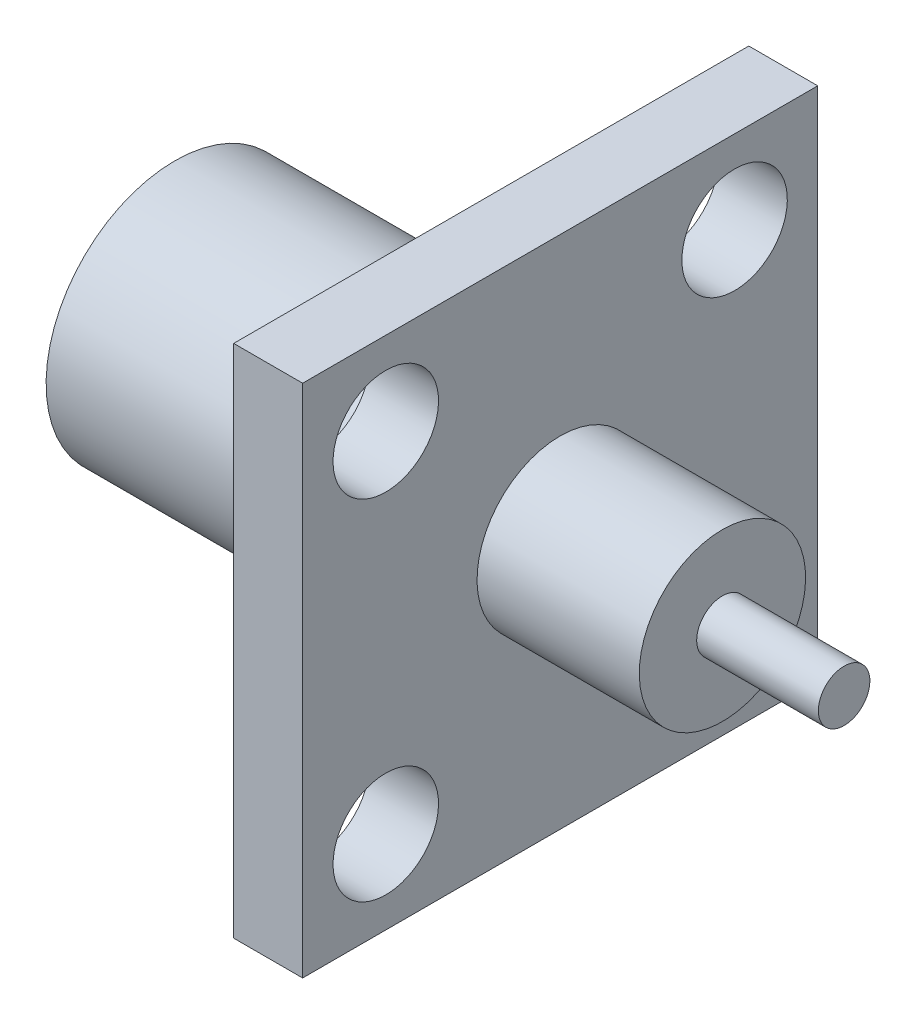
ISO-10303-21;
HEADER;
FILE_DESCRIPTION(('STEP AP214'),'2;1');
FILE_NAME('part.step','',(''),(''),'','','');
FILE_SCHEMA(('AUTOMOTIVE_DESIGN { 1 0 10303 214 1 1 1 1 }'));
ENDSEC;
DATA;
#1=APPLICATION_CONTEXT('core data for automotive mechanical design processes');
#2=APPLICATION_PROTOCOL_DEFINITION('international standard','automotive_design',2000,#1);
#3=PRODUCT_CONTEXT('',#1,'mechanical');
#4=PRODUCT('Part','Part','',(#3));
#5=PRODUCT_RELATED_PRODUCT_CATEGORY('part','',(#4));
#6=PRODUCT_DEFINITION_FORMATION('','',#4);
#7=PRODUCT_DEFINITION_CONTEXT('part definition',#1,'design');
#8=PRODUCT_DEFINITION('design','',#6,#7);
#9=PRODUCT_DEFINITION_SHAPE('','',#8);
#10=(LENGTH_UNIT() NAMED_UNIT(*) SI_UNIT(.MILLI.,.METRE.));
#11=(NAMED_UNIT(*) PLANE_ANGLE_UNIT() SI_UNIT($,.RADIAN.));
#12=(NAMED_UNIT(*) SI_UNIT($,.STERADIAN.) SOLID_ANGLE_UNIT());
#13=UNCERTAINTY_MEASURE_WITH_UNIT(LENGTH_MEASURE(1.E-05),#10,'distance_accuracy_value','');
#14=(GEOMETRIC_REPRESENTATION_CONTEXT(3) GLOBAL_UNCERTAINTY_ASSIGNED_CONTEXT((#13)) GLOBAL_UNIT_ASSIGNED_CONTEXT((#10,
#11,#12)) REPRESENTATION_CONTEXT('',''));
#15=CARTESIAN_POINT('',(0.,0.,0.));
#16=DIRECTION('',(0.,0.,1.));
#17=DIRECTION('',(1.,0.,0.));
#18=AXIS2_PLACEMENT_3D('',#15,#16,#17);
#19=CARTESIAN_POINT('',(2.7,10.725,3.89949632730069));
#20=DIRECTION('',(-1.,0.,0.));
#21=DIRECTION('',(0.,-1.,0.));
#22=AXIS2_PLACEMENT_3D('',#19,#20,#21);
#23=CYLINDRICAL_SURFACE('',#22,0.635);
#24=CARTESIAN_POINT('',(2.7,10.725,3.89949632730069));
#25=DIRECTION('',(1.,0.,0.));
#26=DIRECTION('',(0.,1.,0.));
#27=AXIS2_PLACEMENT_3D('',#24,#25,#26);
#28=CIRCLE('',#27,0.635);
#29=CARTESIAN_POINT('',(2.7,11.36,3.89949632730069));
#30=VERTEX_POINT('',#29);
#31=EDGE_CURVE('P0_E10',#30,#30,#28,.T.);
#32=ORIENTED_EDGE('',*,*,#31,.F.);
#33=EDGE_LOOP('',(#32));
#34=FACE_BOUND('',#33,.T.);
#35=CARTESIAN_POINT('',(-6.,10.725,3.89949632730069));
#36=DIRECTION('',(1.,0.,0.));
#37=DIRECTION('',(0.,1.,0.));
#38=AXIS2_PLACEMENT_3D('',#35,#36,#37);
#39=CIRCLE('',#38,0.635);
#40=CARTESIAN_POINT('',(-6.,11.36,3.89949632730069));
#41=VERTEX_POINT('',#40);
#42=EDGE_CURVE('P0_E18',#41,#41,#39,.T.);
#43=ORIENTED_EDGE('',*,*,#42,.T.);
#44=EDGE_LOOP('',(#43));
#45=FACE_BOUND('',#44,.T.);
#46=ADVANCED_FACE('P0_F15',(#34,#45),#23,.T.);
#47=CARTESIAN_POINT('',(2.7,10.725,3.89949632730069));
#48=DIRECTION('',(1.,0.,0.));
#49=DIRECTION('',(0.,1.,0.));
#50=AXIS2_PLACEMENT_3D('',#47,#48,#49);
#51=PLANE('',#50);
#52=ORIENTED_EDGE('',*,*,#31,.T.);
#53=EDGE_LOOP('',(#52));
#54=FACE_BOUND('',#53,.T.);
#55=ADVANCED_FACE('P0_F30',(#54),#51,.T.);
#56=CARTESIAN_POINT('',(-6.,10.725,3.89949632730069));
#57=DIRECTION('',(1.,0.,0.));
#58=DIRECTION('',(0.,1.,0.));
#59=AXIS2_PLACEMENT_3D('',#56,#57,#58);
#60=PLANE('',#59);
#61=ORIENTED_EDGE('',*,*,#42,.F.);
#62=EDGE_LOOP('',(#61));
#63=FACE_BOUND('',#62,.T.);
#64=ADVANCED_FACE('P0_F28',(#63),#60,.F.);
#65=CLOSED_SHELL('',(#46,#55,#64));
#66=MANIFOLD_SOLID_BREP('P0_B1',#65);
#67=CARTESIAN_POINT('',(-0.299999999999998,10.725,3.89949632730069));
#68=DIRECTION('',(1.,0.,0.));
#69=DIRECTION('',(0.,1.,0.));
#70=AXIS2_PLACEMENT_3D('',#67,#68,#69);
#71=PLANE('',#70);
#72=CARTESIAN_POINT('',(-0.299999999999998,10.725,3.89949632730069));
#73=DIRECTION('',(1.,0.,0.));
#74=DIRECTION('',(0.,1.,0.));
#75=AXIS2_PLACEMENT_3D('',#72,#73,#74);
#76=CIRCLE('',#75,2.05);
#77=CARTESIAN_POINT('',(-0.299999999999998,12.775,3.89949632730069));
#78=VERTEX_POINT('',#77);
#79=EDGE_CURVE('P1_E10',#78,#78,#76,.T.);
#80=ORIENTED_EDGE('',*,*,#79,.T.);
#81=EDGE_LOOP('',(#80));
#82=FACE_BOUND('',#81,.T.);
#83=CARTESIAN_POINT('',(-0.299999999999998,10.725,3.89949632730069));
#84=DIRECTION('',(1.,0.,0.));
#85=DIRECTION('',(0.,1.,0.));
#86=AXIS2_PLACEMENT_3D('',#83,#84,#85);
#87=CIRCLE('',#86,0.635);
#88=CARTESIAN_POINT('',(-0.299999999999998,11.36,3.89949632730069));
#89=VERTEX_POINT('',#88);
#90=EDGE_CURVE('P1_E26',#89,#89,#87,.T.);
#91=ORIENTED_EDGE('',*,*,#90,.F.);
#92=EDGE_LOOP('',(#91));
#93=FACE_BOUND('',#92,.T.);
#94=ADVANCED_FACE('P1_F15',(#82,#93),#71,.T.);
#95=CARTESIAN_POINT('',(-4.3,10.725,3.89949632730069));
#96=DIRECTION('',(1.,0.,0.));
#97=DIRECTION('',(0.,1.,0.));
#98=AXIS2_PLACEMENT_3D('',#95,#96,#97);
#99=PLANE('',#98);
#100=CARTESIAN_POINT('',(-4.3,10.725,3.89949632730069));
#101=DIRECTION('',(1.,0.,0.));
#102=DIRECTION('',(0.,1.,0.));
#103=AXIS2_PLACEMENT_3D('',#100,#101,#102);
#104=CIRCLE('',#103,2.05);
#105=CARTESIAN_POINT('',(-4.3,12.775,3.89949632730069));
#106=VERTEX_POINT('',#105);
#107=EDGE_CURVE('P1_E19',#106,#106,#104,.T.);
#108=ORIENTED_EDGE('',*,*,#107,.F.);
#109=EDGE_LOOP('',(#108));
#110=FACE_BOUND('',#109,.T.);
#111=CARTESIAN_POINT('',(-4.3,10.725,3.89949632730069));
#112=DIRECTION('',(1.,0.,0.));
#113=DIRECTION('',(0.,1.,0.));
#114=AXIS2_PLACEMENT_3D('',#111,#112,#113);
#115=CIRCLE('',#114,0.635);
#116=CARTESIAN_POINT('',(-4.3,11.36,3.89949632730069));
#117=VERTEX_POINT('',#116);
#118=EDGE_CURVE('P1_E28',#117,#117,#115,.T.);
#119=ORIENTED_EDGE('',*,*,#118,.T.);
#120=EDGE_LOOP('',(#119));
#121=FACE_BOUND('',#120,.T.);
#122=ADVANCED_FACE('P1_F38',(#110,#121),#99,.F.);
#123=CARTESIAN_POINT('',(-0.299999999999998,10.725,3.89949632730069));
#124=DIRECTION('',(-1.,0.,0.));
#125=DIRECTION('',(0.,-1.,0.));
#126=AXIS2_PLACEMENT_3D('',#123,#124,#125);
#127=CYLINDRICAL_SURFACE('',#126,2.05);
#128=ORIENTED_EDGE('',*,*,#79,.F.);
#129=EDGE_LOOP('',(#128));
#130=FACE_BOUND('',#129,.T.);
#131=ORIENTED_EDGE('',*,*,#107,.T.);
#132=EDGE_LOOP('',(#131));
#133=FACE_BOUND('',#132,.T.);
#134=ADVANCED_FACE('P1_F17',(#130,#133),#127,.T.);
#135=CARTESIAN_POINT('',(-0.299999999999998,10.725,3.89949632730069));
#136=DIRECTION('',(-1.,0.,0.));
#137=DIRECTION('',(0.,-1.,0.));
#138=AXIS2_PLACEMENT_3D('',#135,#136,#137);
#139=CYLINDRICAL_SURFACE('',#138,0.635);
#140=ORIENTED_EDGE('',*,*,#90,.T.);
#141=EDGE_LOOP('',(#140));
#142=FACE_BOUND('',#141,.T.);
#143=ORIENTED_EDGE('',*,*,#118,.F.);
#144=EDGE_LOOP('',(#143));
#145=FACE_BOUND('',#144,.T.);
#146=ADVANCED_FACE('P1_F34',(#142,#145),#139,.F.);
#147=CLOSED_SHELL('',(#94,#122,#134,#146));
#148=MANIFOLD_SOLID_BREP('P1_B1',#147);
#149=CARTESIAN_POINT('',(-6.,4.375,-2.45050367269928));
#150=DIRECTION('',(0.,-1.,0.));
#151=DIRECTION('',(1.,0.,0.));
#152=AXIS2_PLACEMENT_3D('',#149,#150,#151);
#153=PLANE('',#152);
#154=DIRECTION('',(0.,0.,-1.));
#155=VECTOR('',#154,1.);
#156=CARTESIAN_POINT('',(-4.3,4.375,-2.45050367269928));
#157=LINE('',#156,#155);
#158=CARTESIAN_POINT('',(-4.3,4.375,10.2494963273008));
#159=VERTEX_POINT('',#158);
#160=CARTESIAN_POINT('',(-4.3,4.375,-2.45050367269928));
#161=VERTEX_POINT('',#160);
#162=EDGE_CURVE('P2_E83',#159,#161,#157,.T.);
#163=ORIENTED_EDGE('',*,*,#162,.F.);
#164=DIRECTION('',(1.,0.,0.));
#165=VECTOR('',#164,1.);
#166=CARTESIAN_POINT('',(-6.,4.375,10.2494963273008));
#167=LINE('',#166,#165);
#168=CARTESIAN_POINT('',(-6.,4.375,10.2494963273008));
#169=VERTEX_POINT('',#168);
#170=EDGE_CURVE('P2_E24',#169,#159,#167,.T.);
#171=ORIENTED_EDGE('',*,*,#170,.F.);
#172=DIRECTION('',(0.,0.,-1.));
#173=VECTOR('',#172,1.);
#174=CARTESIAN_POINT('',(-6.,4.375,-2.45050367269928));
#175=LINE('',#174,#173);
#176=CARTESIAN_POINT('',(-6.,4.375,-2.45050367269928));
#177=VERTEX_POINT('',#176);
#178=EDGE_CURVE('P2_E76',#169,#177,#175,.T.);
#179=ORIENTED_EDGE('',*,*,#178,.T.);
#180=DIRECTION('',(1.,0.,0.));
#181=VECTOR('',#180,1.);
#182=CARTESIAN_POINT('',(-6.,4.375,-2.45050367269928));
#183=LINE('',#182,#181);
#184=EDGE_CURVE('P2_E59',#177,#161,#183,.T.);
#185=ORIENTED_EDGE('',*,*,#184,.T.);
#186=EDGE_LOOP('',(#163,#171,#179,#185));
#187=FACE_BOUND('',#186,.T.);
#188=ADVANCED_FACE('P2_F16',(#187),#153,.T.);
#189=CARTESIAN_POINT('',(-6.,4.375,10.2494963273008));
#190=DIRECTION('',(0.,0.,1.));
#191=DIRECTION('',(1.,0.,0.));
#192=AXIS2_PLACEMENT_3D('',#189,#190,#191);
#193=PLANE('',#192);
#194=DIRECTION('',(0.,-1.,0.));
#195=VECTOR('',#194,1.);
#196=CARTESIAN_POINT('',(-4.3,4.375,10.2494963273008));
#197=LINE('',#196,#195);
#198=CARTESIAN_POINT('',(-4.3,17.075,10.2494963273008));
#199=VERTEX_POINT('',#198);
#200=EDGE_CURVE('P2_E78',#199,#159,#197,.T.);
#201=ORIENTED_EDGE('',*,*,#200,.F.);
#202=DIRECTION('',(1.,0.,0.));
#203=VECTOR('',#202,1.);
#204=CARTESIAN_POINT('',(-6.,17.075,10.2494963273008));
#205=LINE('',#204,#203);
#206=CARTESIAN_POINT('',(-6.,17.075,10.2494963273008));
#207=VERTEX_POINT('',#206);
#208=EDGE_CURVE('P2_E48',#207,#199,#205,.T.);
#209=ORIENTED_EDGE('',*,*,#208,.F.);
#210=DIRECTION('',(0.,-1.,0.));
#211=VECTOR('',#210,1.);
#212=CARTESIAN_POINT('',(-6.,4.375,10.2494963273008));
#213=LINE('',#212,#211);
#214=EDGE_CURVE('P2_E73',#207,#169,#213,.T.);
#215=ORIENTED_EDGE('',*,*,#214,.T.);
#216=ORIENTED_EDGE('',*,*,#170,.T.);
#217=EDGE_LOOP('',(#201,#209,#215,#216));
#218=FACE_BOUND('',#217,.T.);
#219=ADVANCED_FACE('P2_F95',(#218),#193,.T.);
#220=CARTESIAN_POINT('',(-6.,17.075,-2.45050367269928));
#221=DIRECTION('',(0.,1.,0.));
#222=DIRECTION('',(-1.,0.,0.));
#223=AXIS2_PLACEMENT_3D('',#220,#221,#222);
#224=PLANE('',#223);
#225=DIRECTION('',(0.,0.,1.));
#226=VECTOR('',#225,1.);
#227=CARTESIAN_POINT('',(-4.3,17.075,-2.45050367269928));
#228=LINE('',#227,#226);
#229=CARTESIAN_POINT('',(-4.3,17.075,-2.45050367269928));
#230=VERTEX_POINT('',#229);
#231=EDGE_CURVE('P2_E67',#230,#199,#228,.T.);
#232=ORIENTED_EDGE('',*,*,#231,.F.);
#233=DIRECTION('',(1.,0.,0.));
#234=VECTOR('',#233,1.);
#235=CARTESIAN_POINT('',(-6.,17.075,-2.45050367269928));
#236=LINE('',#235,#234);
#237=CARTESIAN_POINT('',(-6.,17.075,-2.45050367269928));
#238=VERTEX_POINT('',#237);
#239=EDGE_CURVE('P2_E62',#238,#230,#236,.T.);
#240=ORIENTED_EDGE('',*,*,#239,.F.);
#241=DIRECTION('',(0.,0.,1.));
#242=VECTOR('',#241,1.);
#243=CARTESIAN_POINT('',(-6.,17.075,-2.45050367269928));
#244=LINE('',#243,#242);
#245=EDGE_CURVE('P2_E65',#238,#207,#244,.T.);
#246=ORIENTED_EDGE('',*,*,#245,.T.);
#247=ORIENTED_EDGE('',*,*,#208,.T.);
#248=EDGE_LOOP('',(#232,#240,#246,#247));
#249=FACE_BOUND('',#248,.T.);
#250=ADVANCED_FACE('P2_F64',(#249),#224,.T.);
#251=CARTESIAN_POINT('',(-6.,4.375,-2.45050367269928));
#252=DIRECTION('',(0.,0.,-1.));
#253=DIRECTION('',(-1.,0.,0.));
#254=AXIS2_PLACEMENT_3D('',#251,#252,#253);
#255=PLANE('',#254);
#256=DIRECTION('',(0.,1.,0.));
#257=VECTOR('',#256,1.);
#258=CARTESIAN_POINT('',(-4.3,4.375,-2.45050367269928));
#259=LINE('',#258,#257);
#260=EDGE_CURVE('P2_E86',#161,#230,#259,.T.);
#261=ORIENTED_EDGE('',*,*,#260,.F.);
#262=ORIENTED_EDGE('',*,*,#184,.F.);
#263=DIRECTION('',(0.,1.,0.));
#264=VECTOR('',#263,1.);
#265=CARTESIAN_POINT('',(-6.,4.375,-2.45050367269928));
#266=LINE('',#265,#264);
#267=EDGE_CURVE('P2_E72',#177,#238,#266,.T.);
#268=ORIENTED_EDGE('',*,*,#267,.T.);
#269=ORIENTED_EDGE('',*,*,#239,.T.);
#270=EDGE_LOOP('',(#261,#262,#268,#269));
#271=FACE_BOUND('',#270,.T.);
#272=ADVANCED_FACE('P2_F75',(#271),#255,.T.);
#273=CARTESIAN_POINT('',(-6.,10.725,3.89949632730069));
#274=DIRECTION('',(-1.,0.,0.));
#275=DIRECTION('',(0.,-1.,0.));
#276=AXIS2_PLACEMENT_3D('',#273,#274,#275);
#277=PLANE('',#276);
#278=CARTESIAN_POINT('',(-6.,10.725,3.89949632730069));
#279=DIRECTION('',(-1.,0.,0.));
#280=DIRECTION('',(0.,-1.,0.));
#281=AXIS2_PLACEMENT_3D('',#278,#279,#280);
#282=CIRCLE('',#281,3.175);
#283=CARTESIAN_POINT('',(-6.,7.55,3.89949632730069));
#284=VERTEX_POINT('',#283);
#285=EDGE_CURVE('P2_E10',#284,#284,#282,.T.);
#286=ORIENTED_EDGE('',*,*,#285,.F.);
#287=EDGE_LOOP('',(#286));
#288=FACE_BOUND('',#287,.T.);
#289=CARTESIAN_POINT('',(-6.,15.025,8.19949632730066));
#290=DIRECTION('',(1.,0.,0.));
#291=DIRECTION('',(0.,1.,0.));
#292=AXIS2_PLACEMENT_3D('',#289,#290,#291);
#293=CIRCLE('',#292,1.3);
#294=CARTESIAN_POINT('',(-6.,16.325,8.19949632730066));
#295=VERTEX_POINT('',#294);
#296=EDGE_CURVE('P2_E163',#295,#295,#293,.T.);
#297=ORIENTED_EDGE('',*,*,#296,.T.);
#298=EDGE_LOOP('',(#297));
#299=FACE_BOUND('',#298,.T.);
#300=CARTESIAN_POINT('',(-6.,15.025,-0.400503672699282));
#301=DIRECTION('',(1.,0.,0.));
#302=DIRECTION('',(0.,1.,0.));
#303=AXIS2_PLACEMENT_3D('',#300,#301,#302);
#304=CIRCLE('',#303,1.3);
#305=CARTESIAN_POINT('',(-6.,16.325,-0.400503672699282));
#306=VERTEX_POINT('',#305);
#307=EDGE_CURVE('P2_E169',#306,#306,#304,.T.);
#308=ORIENTED_EDGE('',*,*,#307,.T.);
#309=EDGE_LOOP('',(#308));
#310=FACE_BOUND('',#309,.T.);
#311=CARTESIAN_POINT('',(-6.,6.425,8.19949632730066));
#312=DIRECTION('',(1.,0.,0.));
#313=DIRECTION('',(0.,1.,0.));
#314=AXIS2_PLACEMENT_3D('',#311,#312,#313);
#315=CIRCLE('',#314,1.3);
#316=CARTESIAN_POINT('',(-6.,7.725,8.19949632730066));
#317=VERTEX_POINT('',#316);
#318=EDGE_CURVE('P2_E175',#317,#317,#315,.T.);
#319=ORIENTED_EDGE('',*,*,#318,.T.);
#320=EDGE_LOOP('',(#319));
#321=FACE_BOUND('',#320,.T.);
#322=CARTESIAN_POINT('',(-6.,6.425,-0.400503672699282));
#323=DIRECTION('',(1.,0.,0.));
#324=DIRECTION('',(0.,1.,0.));
#325=AXIS2_PLACEMENT_3D('',#322,#323,#324);
#326=CIRCLE('',#325,1.3);
#327=CARTESIAN_POINT('',(-6.,7.725,-0.400503672699282));
#328=VERTEX_POINT('',#327);
#329=EDGE_CURVE('P2_E87',#328,#328,#326,.T.);
#330=ORIENTED_EDGE('',*,*,#329,.T.);
#331=EDGE_LOOP('',(#330));
#332=FACE_BOUND('',#331,.T.);
#333=ORIENTED_EDGE('',*,*,#178,.F.);
#334=ORIENTED_EDGE('',*,*,#214,.F.);
#335=ORIENTED_EDGE('',*,*,#245,.F.);
#336=ORIENTED_EDGE('',*,*,#267,.F.);
#337=EDGE_LOOP('',(#333,#334,#335,#336));
#338=FACE_BOUND('',#337,.T.);
#339=ADVANCED_FACE('P2_F71',(#288,#299,#310,#321,#332,#338),#277,.T.);
#340=CARTESIAN_POINT('',(-4.3,10.725,3.89949632730069));
#341=DIRECTION('',(-1.,0.,0.));
#342=DIRECTION('',(0.,-1.,0.));
#343=AXIS2_PLACEMENT_3D('',#340,#341,#342);
#344=PLANE('',#343);
#345=CARTESIAN_POINT('',(-4.3,10.725,3.89949632730069));
#346=DIRECTION('',(1.,0.,0.));
#347=DIRECTION('',(0.,1.,0.));
#348=AXIS2_PLACEMENT_3D('',#345,#346,#347);
#349=CIRCLE('',#348,2.05);
#350=CARTESIAN_POINT('',(-4.3,12.775,3.89949632730069));
#351=VERTEX_POINT('',#350);
#352=EDGE_CURVE('P2_E154',#351,#351,#349,.T.);
#353=ORIENTED_EDGE('',*,*,#352,.F.);
#354=EDGE_LOOP('',(#353));
#355=FACE_BOUND('',#354,.T.);
#356=CARTESIAN_POINT('',(-4.3,15.025,8.19949632730066));
#357=DIRECTION('',(1.,0.,0.));
#358=DIRECTION('',(0.,1.,0.));
#359=AXIS2_PLACEMENT_3D('',#356,#357,#358);
#360=CIRCLE('',#359,1.3);
#361=CARTESIAN_POINT('',(-4.3,16.325,8.19949632730066));
#362=VERTEX_POINT('',#361);
#363=EDGE_CURVE('P2_E161',#362,#362,#360,.T.);
#364=ORIENTED_EDGE('',*,*,#363,.F.);
#365=EDGE_LOOP('',(#364));
#366=FACE_BOUND('',#365,.T.);
#367=CARTESIAN_POINT('',(-4.3,15.025,-0.400503672699282));
#368=DIRECTION('',(1.,0.,0.));
#369=DIRECTION('',(0.,1.,0.));
#370=AXIS2_PLACEMENT_3D('',#367,#368,#369);
#371=CIRCLE('',#370,1.3);
#372=CARTESIAN_POINT('',(-4.3,16.325,-0.400503672699282));
#373=VERTEX_POINT('',#372);
#374=EDGE_CURVE('P2_E166',#373,#373,#371,.T.);
#375=ORIENTED_EDGE('',*,*,#374,.F.);
#376=EDGE_LOOP('',(#375));
#377=FACE_BOUND('',#376,.T.);
#378=CARTESIAN_POINT('',(-4.3,6.425,8.19949632730066));
#379=DIRECTION('',(1.,0.,0.));
#380=DIRECTION('',(0.,1.,0.));
#381=AXIS2_PLACEMENT_3D('',#378,#379,#380);
#382=CIRCLE('',#381,1.3);
#383=CARTESIAN_POINT('',(-4.3,7.725,8.19949632730066));
#384=VERTEX_POINT('',#383);
#385=EDGE_CURVE('P2_E172',#384,#384,#382,.T.);
#386=ORIENTED_EDGE('',*,*,#385,.F.);
#387=EDGE_LOOP('',(#386));
#388=FACE_BOUND('',#387,.T.);
#389=CARTESIAN_POINT('',(-4.3,6.425,-0.400503672699282));
#390=DIRECTION('',(1.,0.,0.));
#391=DIRECTION('',(0.,1.,0.));
#392=AXIS2_PLACEMENT_3D('',#389,#390,#391);
#393=CIRCLE('',#392,1.3);
#394=CARTESIAN_POINT('',(-4.3,7.725,-0.400503672699282));
#395=VERTEX_POINT('',#394);
#396=EDGE_CURVE('P2_E178',#395,#395,#393,.T.);
#397=ORIENTED_EDGE('',*,*,#396,.F.);
#398=EDGE_LOOP('',(#397));
#399=FACE_BOUND('',#398,.T.);
#400=ORIENTED_EDGE('',*,*,#162,.T.);
#401=ORIENTED_EDGE('',*,*,#260,.T.);
#402=ORIENTED_EDGE('',*,*,#231,.T.);
#403=ORIENTED_EDGE('',*,*,#200,.T.);
#404=EDGE_LOOP('',(#400,#401,#402,#403));
#405=FACE_BOUND('',#404,.T.);
#406=ADVANCED_FACE('P2_F94',(#355,#366,#377,#388,#399,#405),#344,.F.);
#407=CARTESIAN_POINT('',(-6.,6.425,-0.400503672699282));
#408=DIRECTION('',(1.,0.,0.));
#409=DIRECTION('',(0.,1.,0.));
#410=AXIS2_PLACEMENT_3D('',#407,#408,#409);
#411=CYLINDRICAL_SURFACE('',#410,1.3);
#412=ORIENTED_EDGE('',*,*,#329,.F.);
#413=EDGE_LOOP('',(#412));
#414=FACE_BOUND('',#413,.T.);
#415=ORIENTED_EDGE('',*,*,#396,.T.);
#416=EDGE_LOOP('',(#415));
#417=FACE_BOUND('',#416,.T.);
#418=ADVANCED_FACE('P2_F114',(#414,#417),#411,.F.);
#419=CARTESIAN_POINT('',(-6.,6.425,8.19949632730066));
#420=DIRECTION('',(1.,0.,0.));
#421=DIRECTION('',(0.,1.,0.));
#422=AXIS2_PLACEMENT_3D('',#419,#420,#421);
#423=CYLINDRICAL_SURFACE('',#422,1.3);
#424=ORIENTED_EDGE('',*,*,#318,.F.);
#425=EDGE_LOOP('',(#424));
#426=FACE_BOUND('',#425,.T.);
#427=ORIENTED_EDGE('',*,*,#385,.T.);
#428=EDGE_LOOP('',(#427));
#429=FACE_BOUND('',#428,.T.);
#430=ADVANCED_FACE('P2_F121',(#426,#429),#423,.F.);
#431=CARTESIAN_POINT('',(-6.,15.025,-0.400503672699282));
#432=DIRECTION('',(1.,0.,0.));
#433=DIRECTION('',(0.,1.,0.));
#434=AXIS2_PLACEMENT_3D('',#431,#432,#433);
#435=CYLINDRICAL_SURFACE('',#434,1.3);
#436=ORIENTED_EDGE('',*,*,#307,.F.);
#437=EDGE_LOOP('',(#436));
#438=FACE_BOUND('',#437,.T.);
#439=ORIENTED_EDGE('',*,*,#374,.T.);
#440=EDGE_LOOP('',(#439));
#441=FACE_BOUND('',#440,.T.);
#442=ADVANCED_FACE('P2_F125',(#438,#441),#435,.F.);
#443=CARTESIAN_POINT('',(-6.,15.025,8.19949632730066));
#444=DIRECTION('',(1.,0.,0.));
#445=DIRECTION('',(0.,1.,0.));
#446=AXIS2_PLACEMENT_3D('',#443,#444,#445);
#447=CYLINDRICAL_SURFACE('',#446,1.3);
#448=ORIENTED_EDGE('',*,*,#296,.F.);
#449=EDGE_LOOP('',(#448));
#450=FACE_BOUND('',#449,.T.);
#451=ORIENTED_EDGE('',*,*,#363,.T.);
#452=EDGE_LOOP('',(#451));
#453=FACE_BOUND('',#452,.T.);
#454=ADVANCED_FACE('P2_F129',(#450,#453),#447,.F.);
#455=CARTESIAN_POINT('',(-6.,10.725,3.89949632730069));
#456=DIRECTION('',(1.,0.,0.));
#457=DIRECTION('',(0.,1.,0.));
#458=AXIS2_PLACEMENT_3D('',#455,#456,#457);
#459=CYLINDRICAL_SURFACE('',#458,2.05);
#460=CARTESIAN_POINT('',(-6.,10.725,3.89949632730069));
#461=DIRECTION('',(1.,0.,0.));
#462=DIRECTION('',(0.,1.,0.));
#463=AXIS2_PLACEMENT_3D('',#460,#461,#462);
#464=CIRCLE('',#463,2.05);
#465=CARTESIAN_POINT('',(-6.,12.775,3.89949632730069));
#466=VERTEX_POINT('',#465);
#467=EDGE_CURVE('P2_E157',#466,#466,#464,.T.);
#468=ORIENTED_EDGE('',*,*,#467,.F.);
#469=EDGE_LOOP('',(#468));
#470=FACE_BOUND('',#469,.T.);
#471=ORIENTED_EDGE('',*,*,#352,.T.);
#472=EDGE_LOOP('',(#471));
#473=FACE_BOUND('',#472,.T.);
#474=ADVANCED_FACE('P2_F133',(#470,#473),#459,.F.);
#475=CARTESIAN_POINT('',(-6.,10.725,3.89949632730069));
#476=DIRECTION('',(1.,0.,0.));
#477=DIRECTION('',(0.,1.,0.));
#478=AXIS2_PLACEMENT_3D('',#475,#476,#477);
#479=PLANE('',#478);
#480=ORIENTED_EDGE('',*,*,#467,.T.);
#481=EDGE_LOOP('',(#480));
#482=FACE_BOUND('',#481,.T.);
#483=ADVANCED_FACE('P2_F137',(#482),#479,.T.);
#484=CARTESIAN_POINT('',(-13.8,10.725,3.89949632730069));
#485=DIRECTION('',(1.,0.,0.));
#486=DIRECTION('',(0.,1.,0.));
#487=AXIS2_PLACEMENT_3D('',#484,#485,#486);
#488=CYLINDRICAL_SURFACE('',#487,3.175);
#489=CARTESIAN_POINT('',(-13.8,10.725,3.89949632730069));
#490=DIRECTION('',(1.,0.,0.));
#491=DIRECTION('',(0.,1.,0.));
#492=AXIS2_PLACEMENT_3D('',#489,#490,#491);
#493=CIRCLE('',#492,3.175);
#494=CARTESIAN_POINT('',(-13.8,13.9,3.89949632730069));
#495=VERTEX_POINT('',#494);
#496=EDGE_CURVE('P2_E153',#495,#495,#493,.T.);
#497=ORIENTED_EDGE('',*,*,#496,.T.);
#498=EDGE_LOOP('',(#497));
#499=FACE_BOUND('',#498,.T.);
#500=ORIENTED_EDGE('',*,*,#285,.T.);
#501=EDGE_LOOP('',(#500));
#502=FACE_BOUND('',#501,.T.);
#503=ADVANCED_FACE('P2_F139',(#499,#502),#488,.T.);
#504=CARTESIAN_POINT('',(-13.8,10.725,3.89949632730069));
#505=DIRECTION('',(1.,0.,0.));
#506=DIRECTION('',(0.,1.,0.));
#507=AXIS2_PLACEMENT_3D('',#504,#505,#506);
#508=PLANE('',#507);
#509=ORIENTED_EDGE('',*,*,#496,.F.);
#510=EDGE_LOOP('',(#509));
#511=FACE_BOUND('',#510,.T.);
#512=ADVANCED_FACE('P2_F142',(#511),#508,.F.);
#513=CLOSED_SHELL('',(#188,#219,#250,#272,#339,#406,#418,#430,#442,#454,#474,#483,#503,#512));
#514=MANIFOLD_SOLID_BREP('P2_B1',#513);
#515=ADVANCED_BREP_SHAPE_REPRESENTATION('',(#18,#66,#148,#514),#14);
#516=SHAPE_DEFINITION_REPRESENTATION(#9,#515);
ENDSEC;
END-ISO-10303-21;
